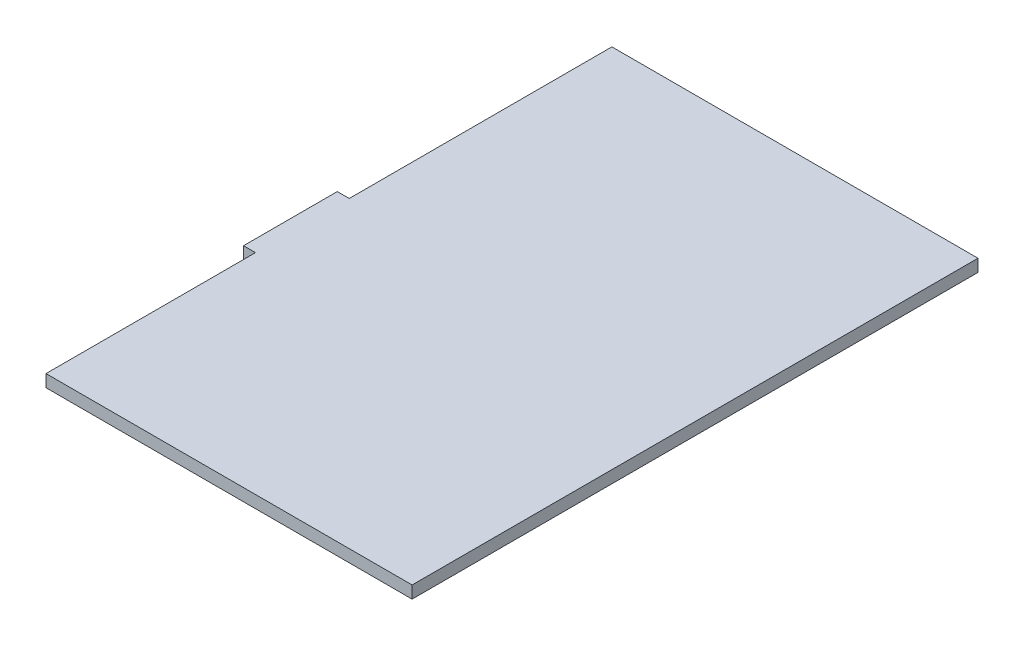
ISO-10303-21;
HEADER;
FILE_DESCRIPTION(('STEP AP214'),'2;1');
FILE_NAME('part.step','',(''),(''),'','','');
FILE_SCHEMA(('AUTOMOTIVE_DESIGN { 1 0 10303 214 1 1 1 1 }'));
ENDSEC;
DATA;
#1=APPLICATION_CONTEXT('core data for automotive mechanical design processes');
#2=APPLICATION_PROTOCOL_DEFINITION('international standard','automotive_design',2000,#1);
#3=PRODUCT_CONTEXT('',#1,'mechanical');
#4=PRODUCT('Part','Part','',(#3));
#5=PRODUCT_RELATED_PRODUCT_CATEGORY('part','',(#4));
#6=PRODUCT_DEFINITION_FORMATION('','',#4);
#7=PRODUCT_DEFINITION_CONTEXT('part definition',#1,'design');
#8=PRODUCT_DEFINITION('design','',#6,#7);
#9=PRODUCT_DEFINITION_SHAPE('','',#8);
#10=(LENGTH_UNIT() NAMED_UNIT(*) SI_UNIT(.MILLI.,.METRE.));
#11=(NAMED_UNIT(*) PLANE_ANGLE_UNIT() SI_UNIT($,.RADIAN.));
#12=(NAMED_UNIT(*) SI_UNIT($,.STERADIAN.) SOLID_ANGLE_UNIT());
#13=UNCERTAINTY_MEASURE_WITH_UNIT(LENGTH_MEASURE(1.E-05),#10,'distance_accuracy_value','');
#14=(GEOMETRIC_REPRESENTATION_CONTEXT(3) GLOBAL_UNCERTAINTY_ASSIGNED_CONTEXT((#13)) GLOBAL_UNIT_ASSIGNED_CONTEXT((#10,
#11,#12)) REPRESENTATION_CONTEXT('',''));
#15=CARTESIAN_POINT('',(0.,0.,0.));
#16=DIRECTION('',(0.,0.,1.));
#17=DIRECTION('',(1.,0.,0.));
#18=AXIS2_PLACEMENT_3D('',#15,#16,#17);
#19=CARTESIAN_POINT('',(358.121789204402,754.380000017288,884.700014425757));
#20=DIRECTION('',(0.,-1.,0.));
#21=DIRECTION('',(0.,0.,-1.));
#22=AXIS2_PLACEMENT_3D('',#19,#20,#21);
#23=PLANE('',#22);
#24=DIRECTION('',(-1.,0.,0.));
#25=VECTOR('',#24,1.);
#26=CARTESIAN_POINT('',(0.,754.380000017288,213.362507046261));
#27=LINE('',#26,#25);
#28=CARTESIAN_POINT('',(265.355188860333,754.380000017288,213.362507046261));
#29=VERTEX_POINT('',#28);
#30=CARTESIAN_POINT('',(255.630013474232,754.380000017288,213.362507046261));
#31=VERTEX_POINT('',#30);
#32=EDGE_CURVE('E102',#29,#31,#27,.T.);
#33=ORIENTED_EDGE('',*,*,#32,.T.);
#34=DIRECTION('',(0.,0.,1.));
#35=VECTOR('',#34,1.);
#36=CARTESIAN_POINT('',(255.630013474232,754.380000017288,0.));
#37=LINE('',#36,#35);
#38=CARTESIAN_POINT('',(255.630013474232,754.380000017288,289.560014932411));
#39=VERTEX_POINT('',#38);
#40=EDGE_CURVE('E110',#31,#39,#37,.T.);
#41=ORIENTED_EDGE('',*,*,#40,.T.);
#42=DIRECTION('',(-1.,0.,0.));
#43=VECTOR('',#42,1.);
#44=CARTESIAN_POINT('',(0.,754.380000017288,289.560014932411));
#45=LINE('',#44,#43);
#46=CARTESIAN_POINT('',(265.355188860333,754.380000017288,289.560014932411));
#47=VERTEX_POINT('',#46);
#48=EDGE_CURVE('E52',#47,#39,#45,.T.);
#49=ORIENTED_EDGE('',*,*,#48,.F.);
#50=DIRECTION('',(0.,0.,-1.));
#51=VECTOR('',#50,1.);
#52=CARTESIAN_POINT('',(265.355188860333,754.380000017288,0.));
#53=LINE('',#52,#51);
#54=CARTESIAN_POINT('',(265.355188860333,754.380000017288,459.739999999993));
#55=VERTEX_POINT('',#54);
#56=EDGE_CURVE('E113',#55,#47,#53,.T.);
#57=ORIENTED_EDGE('',*,*,#56,.F.);
#58=DIRECTION('',(-1.,0.,0.));
#59=VECTOR('',#58,1.);
#60=CARTESIAN_POINT('',(358.121789204402,754.380000017288,459.739999999993));
#61=LINE('',#60,#59);
#62=CARTESIAN_POINT('',(562.803601280852,754.380000017288,459.739999999993));
#63=VERTEX_POINT('',#62);
#64=EDGE_CURVE('E136',#63,#55,#61,.T.);
#65=ORIENTED_EDGE('',*,*,#64,.F.);
#66=DIRECTION('',(0.,0.,-1.));
#67=VECTOR('',#66,1.);
#68=CARTESIAN_POINT('',(562.803601280852,754.380000017288,884.700014425757));
#69=LINE('',#68,#67);
#70=CARTESIAN_POINT('',(562.803601280852,754.380000017288,0.));
#71=VERTEX_POINT('',#70);
#72=EDGE_CURVE('E116',#63,#71,#69,.T.);
#73=ORIENTED_EDGE('',*,*,#72,.T.);
#74=DIRECTION('',(-1.,0.,0.));
#75=VECTOR('',#74,1.);
#76=CARTESIAN_POINT('',(358.121789204402,754.380000017288,0.));
#77=LINE('',#76,#75);
#78=CARTESIAN_POINT('',(265.355188860333,754.380000017288,0.));
#79=VERTEX_POINT('',#78);
#80=EDGE_CURVE('E119',#71,#79,#77,.T.);
#81=ORIENTED_EDGE('',*,*,#80,.T.);
#82=DIRECTION('',(0.,0.,-1.));
#83=VECTOR('',#82,1.);
#84=CARTESIAN_POINT('',(265.355188860333,754.380000017288,0.));
#85=LINE('',#84,#83);
#86=EDGE_CURVE('E112',#29,#79,#85,.T.);
#87=ORIENTED_EDGE('',*,*,#86,.F.);
#88=EDGE_LOOP('',(#33,#41,#49,#57,#65,#73,#81,#87));
#89=FACE_BOUND('',#88,.T.);
#90=ADVANCED_FACE('F37',(#89),#23,.F.);
#91=CARTESIAN_POINT('',(562.803601280852,744.380000017288,884.700014425757));
#92=DIRECTION('',(0.,1.,0.));
#93=DIRECTION('',(0.,0.,1.));
#94=AXIS2_PLACEMENT_3D('',#91,#92,#93);
#95=PLANE('',#94);
#96=DIRECTION('',(-1.,0.,0.));
#97=VECTOR('',#96,1.);
#98=CARTESIAN_POINT('',(562.803601280852,744.380000017288,213.362507046261));
#99=LINE('',#98,#97);
#100=CARTESIAN_POINT('',(265.355188860333,744.380000017288,213.362507046261));
#101=VERTEX_POINT('',#100);
#102=CARTESIAN_POINT('',(255.630013474232,744.380000017288,213.362507046261));
#103=VERTEX_POINT('',#102);
#104=EDGE_CURVE('E59',#101,#103,#99,.T.);
#105=ORIENTED_EDGE('',*,*,#104,.F.);
#106=DIRECTION('',(0.,0.,-1.));
#107=VECTOR('',#106,1.);
#108=CARTESIAN_POINT('',(265.355188860333,744.380000017288,884.700014425757));
#109=LINE('',#108,#107);
#110=CARTESIAN_POINT('',(265.355188860333,744.380000017288,0.));
#111=VERTEX_POINT('',#110);
#112=EDGE_CURVE('E121',#101,#111,#109,.T.);
#113=ORIENTED_EDGE('',*,*,#112,.T.);
#114=DIRECTION('',(1.,0.,0.));
#115=VECTOR('',#114,1.);
#116=CARTESIAN_POINT('',(562.803601280852,744.380000017288,0.));
#117=LINE('',#116,#115);
#118=CARTESIAN_POINT('',(562.803601280852,744.380000017288,0.));
#119=VERTEX_POINT('',#118);
#120=EDGE_CURVE('E131',#111,#119,#117,.T.);
#121=ORIENTED_EDGE('',*,*,#120,.T.);
#122=DIRECTION('',(0.,0.,-1.));
#123=VECTOR('',#122,1.);
#124=CARTESIAN_POINT('',(562.803601280852,744.380000017288,884.700014425757));
#125=LINE('',#124,#123);
#126=CARTESIAN_POINT('',(562.803601280852,744.380000017288,459.739999999993));
#127=VERTEX_POINT('',#126);
#128=EDGE_CURVE('E130',#127,#119,#125,.T.);
#129=ORIENTED_EDGE('',*,*,#128,.F.);
#130=DIRECTION('',(1.,0.,0.));
#131=VECTOR('',#130,1.);
#132=CARTESIAN_POINT('',(562.803601280852,744.380000017288,459.739999999993));
#133=LINE('',#132,#131);
#134=CARTESIAN_POINT('',(265.355188860333,744.380000017288,459.739999999993));
#135=VERTEX_POINT('',#134);
#136=EDGE_CURVE('E134',#135,#127,#133,.T.);
#137=ORIENTED_EDGE('',*,*,#136,.F.);
#138=DIRECTION('',(0.,0.,-1.));
#139=VECTOR('',#138,1.);
#140=CARTESIAN_POINT('',(265.355188860333,744.380000017288,884.700014425757));
#141=LINE('',#140,#139);
#142=CARTESIAN_POINT('',(265.355188860333,744.380000017288,289.560014932411));
#143=VERTEX_POINT('',#142);
#144=EDGE_CURVE('E174',#135,#143,#141,.T.);
#145=ORIENTED_EDGE('',*,*,#144,.T.);
#146=DIRECTION('',(-1.,0.,0.));
#147=VECTOR('',#146,1.);
#148=CARTESIAN_POINT('',(562.803601280852,744.380000017288,289.560014932411));
#149=LINE('',#148,#147);
#150=CARTESIAN_POINT('',(255.630013474232,744.380000017288,289.560014932411));
#151=VERTEX_POINT('',#150);
#152=EDGE_CURVE('E170',#143,#151,#149,.T.);
#153=ORIENTED_EDGE('',*,*,#152,.T.);
#154=DIRECTION('',(0.,0.,1.));
#155=VECTOR('',#154,1.);
#156=CARTESIAN_POINT('',(255.630013474232,744.380000017288,0.));
#157=LINE('',#156,#155);
#158=EDGE_CURVE('E117',#103,#151,#157,.T.);
#159=ORIENTED_EDGE('',*,*,#158,.F.);
#160=EDGE_LOOP('',(#105,#113,#121,#129,#137,#145,#153,#159));
#161=FACE_BOUND('',#160,.T.);
#162=ADVANCED_FACE('F176',(#161),#95,.F.);
#163=CARTESIAN_POINT('',(255.630013474232,754.380000017288,0.));
#164=DIRECTION('',(1.,0.,0.));
#165=DIRECTION('',(0.,0.,-1.));
#166=AXIS2_PLACEMENT_3D('',#163,#164,#165);
#167=PLANE('',#166);
#168=DIRECTION('',(0.,1.,0.));
#169=VECTOR('',#168,1.);
#170=CARTESIAN_POINT('',(255.630013474232,754.380000017288,213.362507046261));
#171=LINE('',#170,#169);
#172=EDGE_CURVE('E11',#103,#31,#171,.T.);
#173=ORIENTED_EDGE('',*,*,#172,.F.);
#174=ORIENTED_EDGE('',*,*,#158,.T.);
#175=DIRECTION('',(0.,1.,0.));
#176=VECTOR('',#175,1.);
#177=CARTESIAN_POINT('',(255.630013474232,754.380000017288,289.560014932411));
#178=LINE('',#177,#176);
#179=EDGE_CURVE('E45',#151,#39,#178,.T.);
#180=ORIENTED_EDGE('',*,*,#179,.T.);
#181=ORIENTED_EDGE('',*,*,#40,.F.);
#182=EDGE_LOOP('',(#173,#174,#180,#181));
#183=FACE_BOUND('',#182,.T.);
#184=ADVANCED_FACE('F115',(#183),#167,.F.);
#185=CARTESIAN_POINT('',(562.803601280852,754.380000017288,884.700014425757));
#186=DIRECTION('',(-1.,0.,0.));
#187=DIRECTION('',(0.,0.,1.));
#188=AXIS2_PLACEMENT_3D('',#185,#186,#187);
#189=PLANE('',#188);
#190=DIRECTION('',(0.,1.,0.));
#191=VECTOR('',#190,1.);
#192=CARTESIAN_POINT('',(562.803601280852,754.380000017288,459.739999999993));
#193=LINE('',#192,#191);
#194=EDGE_CURVE('E129',#127,#63,#193,.T.);
#195=ORIENTED_EDGE('',*,*,#194,.F.);
#196=ORIENTED_EDGE('',*,*,#128,.T.);
#197=DIRECTION('',(0.,1.,0.));
#198=VECTOR('',#197,1.);
#199=CARTESIAN_POINT('',(562.803601280852,754.380000017288,0.));
#200=LINE('',#199,#198);
#201=EDGE_CURVE('E126',#119,#71,#200,.T.);
#202=ORIENTED_EDGE('',*,*,#201,.T.);
#203=ORIENTED_EDGE('',*,*,#72,.F.);
#204=EDGE_LOOP('',(#195,#196,#202,#203));
#205=FACE_BOUND('',#204,.T.);
#206=ADVANCED_FACE('F145',(#205),#189,.F.);
#207=CARTESIAN_POINT('',(0.,0.,0.));
#208=DIRECTION('',(0.,0.,-1.));
#209=DIRECTION('',(-1.,0.,0.));
#210=AXIS2_PLACEMENT_3D('',#207,#208,#209);
#211=PLANE('',#210);
#212=DIRECTION('',(0.,1.,0.));
#213=VECTOR('',#212,1.);
#214=CARTESIAN_POINT('',(265.355188860333,691.380000017288,0.));
#215=LINE('',#214,#213);
#216=EDGE_CURVE('E153',#111,#79,#215,.T.);
#217=ORIENTED_EDGE('',*,*,#216,.T.);
#218=ORIENTED_EDGE('',*,*,#80,.F.);
#219=ORIENTED_EDGE('',*,*,#201,.F.);
#220=ORIENTED_EDGE('',*,*,#120,.F.);
#221=EDGE_LOOP('',(#217,#218,#219,#220));
#222=FACE_BOUND('',#221,.T.);
#223=ADVANCED_FACE('F152',(#222),#211,.T.);
#224=CARTESIAN_POINT('',(0.653479576781392,-9.40841954528615,459.739999999993));
#225=DIRECTION('',(0.,0.,1.));
#226=DIRECTION('',(1.,0.,0.));
#227=AXIS2_PLACEMENT_3D('',#224,#225,#226);
#228=PLANE('',#227);
#229=ORIENTED_EDGE('',*,*,#64,.T.);
#230=DIRECTION('',(0.,1.,0.));
#231=VECTOR('',#230,1.);
#232=CARTESIAN_POINT('',(265.355188860333,691.380000017288,459.739999999993));
#233=LINE('',#232,#231);
#234=EDGE_CURVE('E167',#135,#55,#233,.T.);
#235=ORIENTED_EDGE('',*,*,#234,.F.);
#236=ORIENTED_EDGE('',*,*,#136,.T.);
#237=ORIENTED_EDGE('',*,*,#194,.T.);
#238=EDGE_LOOP('',(#229,#235,#236,#237));
#239=FACE_BOUND('',#238,.T.);
#240=ADVANCED_FACE('F39',(#239),#228,.T.);
#241=CARTESIAN_POINT('',(265.355188860333,691.380000017288,0.));
#242=DIRECTION('',(1.,0.,0.));
#243=DIRECTION('',(0.,0.,-1.));
#244=AXIS2_PLACEMENT_3D('',#241,#242,#243);
#245=PLANE('',#244);
#246=ORIENTED_EDGE('',*,*,#234,.T.);
#247=ORIENTED_EDGE('',*,*,#56,.T.);
#248=DIRECTION('',(0.,1.,0.));
#249=VECTOR('',#248,1.);
#250=CARTESIAN_POINT('',(265.355188860333,691.380000017288,289.560014932411));
#251=LINE('',#250,#249);
#252=EDGE_CURVE('E166',#143,#47,#251,.T.);
#253=ORIENTED_EDGE('',*,*,#252,.F.);
#254=ORIENTED_EDGE('',*,*,#144,.F.);
#255=EDGE_LOOP('',(#246,#247,#253,#254));
#256=FACE_BOUND('',#255,.T.);
#257=ADVANCED_FACE('F180',(#256),#245,.F.);
#258=CARTESIAN_POINT('',(0.,691.380000017288,289.560014932411));
#259=DIRECTION('',(0.,0.,-1.));
#260=DIRECTION('',(-1.,0.,0.));
#261=AXIS2_PLACEMENT_3D('',#258,#259,#260);
#262=PLANE('',#261);
#263=ORIENTED_EDGE('',*,*,#252,.T.);
#264=ORIENTED_EDGE('',*,*,#48,.T.);
#265=ORIENTED_EDGE('',*,*,#179,.F.);
#266=ORIENTED_EDGE('',*,*,#152,.F.);
#267=EDGE_LOOP('',(#263,#264,#265,#266));
#268=FACE_BOUND('',#267,.T.);
#269=ADVANCED_FACE('F178',(#268),#262,.F.);
#270=CARTESIAN_POINT('',(265.355188860333,691.380000017288,0.));
#271=DIRECTION('',(1.,0.,0.));
#272=DIRECTION('',(0.,0.,-1.));
#273=AXIS2_PLACEMENT_3D('',#270,#271,#272);
#274=PLANE('',#273);
#275=DIRECTION('',(0.,1.,0.));
#276=VECTOR('',#275,1.);
#277=CARTESIAN_POINT('',(265.355188860333,691.380000017288,213.362507046261));
#278=LINE('',#277,#276);
#279=EDGE_CURVE('E158',#101,#29,#278,.T.);
#280=ORIENTED_EDGE('',*,*,#279,.T.);
#281=ORIENTED_EDGE('',*,*,#86,.T.);
#282=ORIENTED_EDGE('',*,*,#216,.F.);
#283=ORIENTED_EDGE('',*,*,#112,.F.);
#284=EDGE_LOOP('',(#280,#281,#282,#283));
#285=FACE_BOUND('',#284,.T.);
#286=ADVANCED_FACE('F156',(#285),#274,.F.);
#287=CARTESIAN_POINT('',(0.,691.380000017288,213.362507046261));
#288=DIRECTION('',(0.,0.,-1.));
#289=DIRECTION('',(-1.,0.,0.));
#290=AXIS2_PLACEMENT_3D('',#287,#288,#289);
#291=PLANE('',#290);
#292=ORIENTED_EDGE('',*,*,#104,.T.);
#293=ORIENTED_EDGE('',*,*,#172,.T.);
#294=ORIENTED_EDGE('',*,*,#32,.F.);
#295=ORIENTED_EDGE('',*,*,#279,.F.);
#296=EDGE_LOOP('',(#292,#293,#294,#295));
#297=FACE_BOUND('',#296,.T.);
#298=ADVANCED_FACE('F101',(#297),#291,.T.);
#299=CLOSED_SHELL('',(#90,#162,#184,#206,#223,#240,#257,#269,#286,#298));
#300=MANIFOLD_SOLID_BREP('B2',#299);
#301=ADVANCED_BREP_SHAPE_REPRESENTATION('',(#18,#300),#14);
#302=SHAPE_DEFINITION_REPRESENTATION(#9,#301);
ENDSEC;
END-ISO-10303-21;
